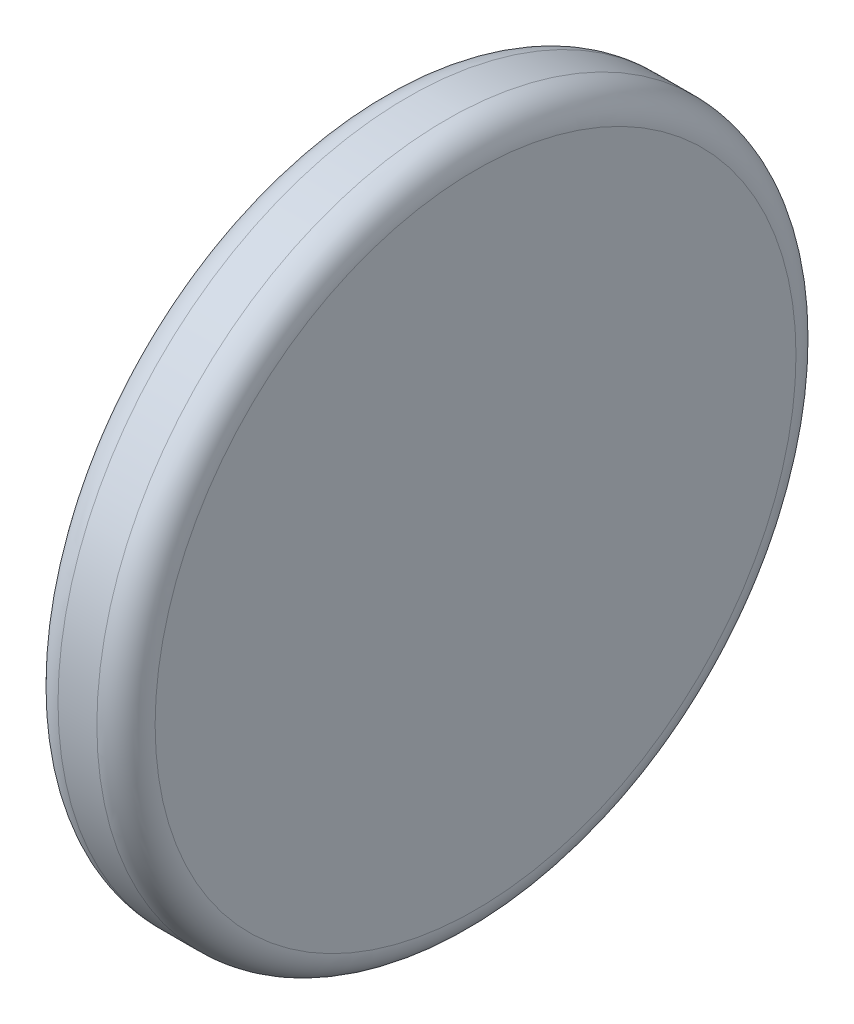
ISO-10303-21;
HEADER;
FILE_DESCRIPTION(('STEP AP214'),'2;1');
FILE_NAME('part.step','',(''),(''),'','','');
FILE_SCHEMA(('AUTOMOTIVE_DESIGN { 1 0 10303 214 1 1 1 1 }'));
ENDSEC;
DATA;
#1=APPLICATION_CONTEXT('core data for automotive mechanical design processes');
#2=APPLICATION_PROTOCOL_DEFINITION('international standard','automotive_design',2000,#1);
#3=PRODUCT_CONTEXT('',#1,'mechanical');
#4=PRODUCT('Part','Part','',(#3));
#5=PRODUCT_RELATED_PRODUCT_CATEGORY('part','',(#4));
#6=PRODUCT_DEFINITION_FORMATION('','',#4);
#7=PRODUCT_DEFINITION_CONTEXT('part definition',#1,'design');
#8=PRODUCT_DEFINITION('design','',#6,#7);
#9=PRODUCT_DEFINITION_SHAPE('','',#8);
#10=(LENGTH_UNIT() NAMED_UNIT(*) SI_UNIT(.MILLI.,.METRE.));
#11=(NAMED_UNIT(*) PLANE_ANGLE_UNIT() SI_UNIT($,.RADIAN.));
#12=(NAMED_UNIT(*) SI_UNIT($,.STERADIAN.) SOLID_ANGLE_UNIT());
#13=UNCERTAINTY_MEASURE_WITH_UNIT(LENGTH_MEASURE(1.E-05),#10,'distance_accuracy_value','');
#14=(GEOMETRIC_REPRESENTATION_CONTEXT(3) GLOBAL_UNCERTAINTY_ASSIGNED_CONTEXT((#13)) GLOBAL_UNIT_ASSIGNED_CONTEXT((#10,
#11,#12)) REPRESENTATION_CONTEXT('',''));
#15=CARTESIAN_POINT('',(0.,0.,0.));
#16=DIRECTION('',(0.,0.,1.));
#17=DIRECTION('',(1.,0.,0.));
#18=AXIS2_PLACEMENT_3D('',#15,#16,#17);
#19=CARTESIAN_POINT('',(0.,0.,0.));
#20=DIRECTION('',(1.,0.,0.));
#21=DIRECTION('',(0.,0.,-1.));
#22=AXIS2_PLACEMENT_3D('',#19,#20,#21);
#23=PLANE('',#22);
#24=CARTESIAN_POINT('',(0.,0.,0.));
#25=DIRECTION('',(1.,0.,0.));
#26=DIRECTION('',(0.,0.,-1.));
#27=AXIS2_PLACEMENT_3D('',#24,#25,#26);
#28=CIRCLE('',#27,33.);
#29=CARTESIAN_POINT('',(0.,0.,-33.));
#30=VERTEX_POINT('',#29);
#31=EDGE_CURVE('E10',#30,#30,#28,.F.);
#32=ORIENTED_EDGE('',*,*,#31,.T.);
#33=EDGE_LOOP('',(#32));
#34=FACE_BOUND('',#33,.T.);
#35=ADVANCED_FACE('F33',(#34),#23,.F.);
#36=CARTESIAN_POINT('',(0.,0.,0.));
#37=DIRECTION('',(-1.,0.,0.));
#38=DIRECTION('',(0.,0.,1.));
#39=AXIS2_PLACEMENT_3D('',#36,#37,#38);
#40=CYLINDRICAL_SURFACE('',#39,36.);
#41=CARTESIAN_POINT('',(7.,0.,0.));
#42=DIRECTION('',(-1.,0.,0.));
#43=DIRECTION('',(0.,0.,1.));
#44=AXIS2_PLACEMENT_3D('',#41,#42,#43);
#45=CIRCLE('',#44,36.);
#46=CARTESIAN_POINT('',(7.,0.,36.));
#47=VERTEX_POINT('',#46);
#48=EDGE_CURVE('E44',#47,#47,#45,.T.);
#49=ORIENTED_EDGE('',*,*,#48,.T.);
#50=EDGE_LOOP('',(#49));
#51=FACE_BOUND('',#50,.T.);
#52=CARTESIAN_POINT('',(3.,0.,0.));
#53=DIRECTION('',(1.,0.,0.));
#54=DIRECTION('',(0.,0.,-1.));
#55=AXIS2_PLACEMENT_3D('',#52,#53,#54);
#56=CIRCLE('',#55,36.);
#57=CARTESIAN_POINT('',(3.,0.,-36.));
#58=VERTEX_POINT('',#57);
#59=EDGE_CURVE('E48',#58,#58,#56,.T.);
#60=ORIENTED_EDGE('',*,*,#59,.T.);
#61=EDGE_LOOP('',(#60));
#62=FACE_BOUND('',#61,.T.);
#63=ADVANCED_FACE('F54',(#51,#62),#40,.T.);
#64=CARTESIAN_POINT('',(10.,0.,0.));
#65=DIRECTION('',(-1.,0.,0.));
#66=DIRECTION('',(0.,0.,1.));
#67=AXIS2_PLACEMENT_3D('',#64,#65,#66);
#68=PLANE('',#67);
#69=CARTESIAN_POINT('',(10.,0.,0.));
#70=DIRECTION('',(-1.,0.,0.));
#71=DIRECTION('',(0.,0.,1.));
#72=AXIS2_PLACEMENT_3D('',#69,#70,#71);
#73=CIRCLE('',#72,33.);
#74=CARTESIAN_POINT('',(10.,0.,33.));
#75=VERTEX_POINT('',#74);
#76=EDGE_CURVE('E40',#75,#75,#73,.F.);
#77=ORIENTED_EDGE('',*,*,#76,.T.);
#78=EDGE_LOOP('',(#77));
#79=FACE_BOUND('',#78,.T.);
#80=ADVANCED_FACE('F62',(#79),#68,.F.);
#81=CARTESIAN_POINT('',(7.,0.,0.));
#82=DIRECTION('',(-1.,0.,0.));
#83=DIRECTION('',(0.,0.,1.));
#84=AXIS2_PLACEMENT_3D('',#81,#82,#83);
#85=TOROIDAL_SURFACE('',#84,33.,3.);
#86=ORIENTED_EDGE('',*,*,#76,.F.);
#87=EDGE_LOOP('',(#86));
#88=FACE_BOUND('',#87,.T.);
#89=ORIENTED_EDGE('',*,*,#48,.F.);
#90=EDGE_LOOP('',(#89));
#91=FACE_BOUND('',#90,.T.);
#92=ADVANCED_FACE('F58',(#88,#91),#85,.T.);
#93=CARTESIAN_POINT('',(3.,0.,0.));
#94=DIRECTION('',(1.,0.,0.));
#95=DIRECTION('',(0.,0.,-1.));
#96=AXIS2_PLACEMENT_3D('',#93,#94,#95);
#97=TOROIDAL_SURFACE('',#96,33.,3.);
#98=ORIENTED_EDGE('',*,*,#59,.F.);
#99=EDGE_LOOP('',(#98));
#100=FACE_BOUND('',#99,.T.);
#101=ORIENTED_EDGE('',*,*,#31,.F.);
#102=EDGE_LOOP('',(#101));
#103=FACE_BOUND('',#102,.T.);
#104=ADVANCED_FACE('F35',(#100,#103),#97,.T.);
#105=CLOSED_SHELL('',(#35,#63,#80,#92,#104));
#106=MANIFOLD_SOLID_BREP('B2',#105);
#107=ADVANCED_BREP_SHAPE_REPRESENTATION('',(#18,#106),#14);
#108=SHAPE_DEFINITION_REPRESENTATION(#9,#107);
ENDSEC;
END-ISO-10303-21;
